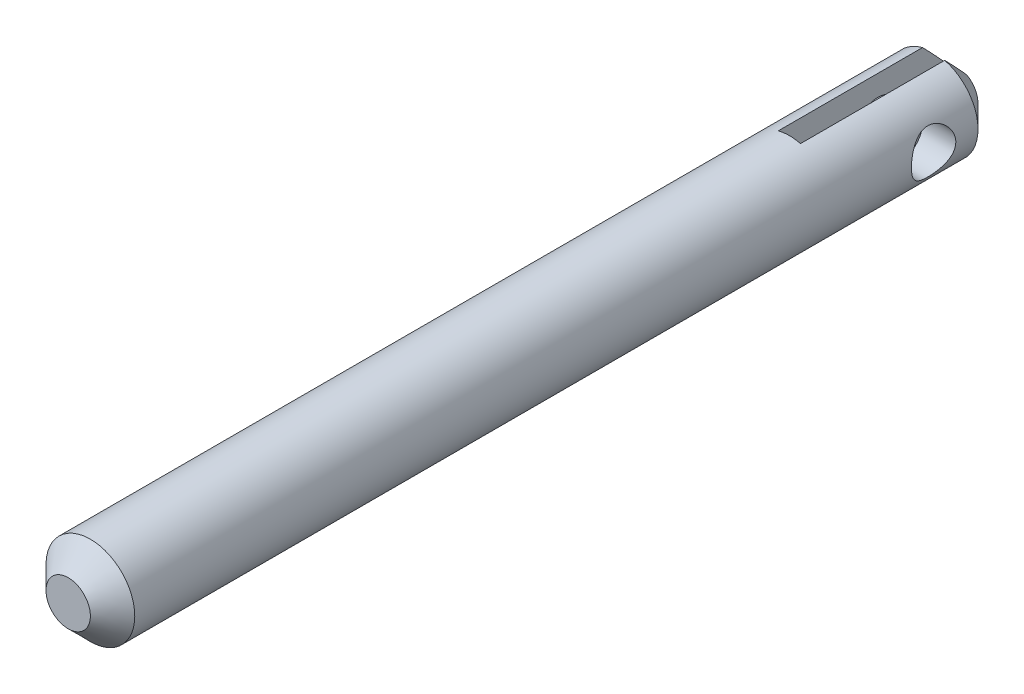
ISO-10303-21;
HEADER;
FILE_DESCRIPTION(('STEP AP214'),'2;1');
FILE_NAME('part.step','',(''),(''),'','','');
FILE_SCHEMA(('AUTOMOTIVE_DESIGN { 1 0 10303 214 1 1 1 1 }'));
ENDSEC;
DATA;
#1=APPLICATION_CONTEXT('core data for automotive mechanical design processes');
#2=APPLICATION_PROTOCOL_DEFINITION('international standard','automotive_design',2000,#1);
#3=PRODUCT_CONTEXT('',#1,'mechanical');
#4=PRODUCT('Part','Part','',(#3));
#5=PRODUCT_RELATED_PRODUCT_CATEGORY('part','',(#4));
#6=PRODUCT_DEFINITION_FORMATION('','',#4);
#7=PRODUCT_DEFINITION_CONTEXT('part definition',#1,'design');
#8=PRODUCT_DEFINITION('design','',#6,#7);
#9=PRODUCT_DEFINITION_SHAPE('','',#8);
#10=(LENGTH_UNIT() NAMED_UNIT(*) SI_UNIT(.MILLI.,.METRE.));
#11=(NAMED_UNIT(*) PLANE_ANGLE_UNIT() SI_UNIT($,.RADIAN.));
#12=(NAMED_UNIT(*) SI_UNIT($,.STERADIAN.) SOLID_ANGLE_UNIT());
#13=UNCERTAINTY_MEASURE_WITH_UNIT(LENGTH_MEASURE(1.E-05),#10,'distance_accuracy_value','');
#14=(GEOMETRIC_REPRESENTATION_CONTEXT(3) GLOBAL_UNCERTAINTY_ASSIGNED_CONTEXT((#13)) GLOBAL_UNIT_ASSIGNED_CONTEXT((#10,
#11,#12)) REPRESENTATION_CONTEXT('',''));
#15=CARTESIAN_POINT('',(0.,0.,0.));
#16=DIRECTION('',(0.,0.,1.));
#17=DIRECTION('',(1.,0.,0.));
#18=AXIS2_PLACEMENT_3D('',#15,#16,#17);
#19=CARTESIAN_POINT('',(0.,0.,0.));
#20=DIRECTION('',(0.,0.,1.));
#21=DIRECTION('',(1.,0.,0.));
#22=AXIS2_PLACEMENT_3D('',#19,#20,#21);
#23=PLANE('',#22);
#24=CARTESIAN_POINT('',(0.,0.,0.));
#25=DIRECTION('',(0.,0.,1.));
#26=DIRECTION('',(1.,0.,0.));
#27=AXIS2_PLACEMENT_3D('',#24,#25,#26);
#28=CIRCLE('',#27,0.999999999999997);
#29=CARTESIAN_POINT('',(-0.5,-0.866025403784436,0.));
#30=VERTEX_POINT('',#29);
#31=CARTESIAN_POINT('',(-0.5,0.866025403784436,0.));
#32=VERTEX_POINT('',#31);
#33=EDGE_CURVE('E109',#30,#32,#28,.F.);
#34=ORIENTED_EDGE('',*,*,#33,.T.);
#35=DIRECTION('',(0.,1.,0.));
#36=VECTOR('',#35,1.);
#37=CARTESIAN_POINT('',(-0.5,-2.,0.));
#38=LINE('',#37,#36);
#39=EDGE_CURVE('E105',#30,#32,#38,.T.);
#40=ORIENTED_EDGE('',*,*,#39,.F.);
#41=EDGE_LOOP('',(#34,#40));
#42=FACE_BOUND('',#41,.T.);
#43=ADVANCED_FACE('F36',(#42),#23,.F.);
#44=CARTESIAN_POINT('',(0.,0.,0.999999999999994));
#45=DIRECTION('',(0.,0.,1.));
#46=DIRECTION('',(1.,0.,0.));
#47=AXIS2_PLACEMENT_3D('',#44,#45,#46);
#48=CONICAL_SURFACE('',#47,2.,0.785398163397453);
#49=CARTESIAN_POINT('',(-0.5,-4.44603678424197,3.47406337537059));
#50=CARTESIAN_POINT('',(-0.5,-4.3227206715832,3.35152236187326));
#51=CARTESIAN_POINT('',(-0.5,-4.19937524468683,3.22901082680239));
#52=CARTESIAN_POINT('',(-0.5,-3.95257998556471,2.98405036082719));
#53=CARTESIAN_POINT('',(-0.5,-3.82913013899456,2.86160144437566));
#54=CARTESIAN_POINT('',(-0.5,-3.58165551808931,2.61634908001688));
#55=CARTESIAN_POINT('',(-0.5,-3.45763033572941,2.4935460436531));
#56=CARTESIAN_POINT('',(-0.5,-3.20945063079193,2.24811314451892));
#57=CARTESIAN_POINT('',(-0.5,-3.08529613387822,2.12548325578782));
#58=CARTESIAN_POINT('',(-0.5,-2.77363505064184,1.81816405947329));
#59=CARTESIAN_POINT('',(-0.5,-2.58599766191415,1.63360712958114));
#60=CARTESIAN_POINT('',(-0.5,-2.30382683253063,1.35738408197601));
#61=CARTESIAN_POINT('',(-0.5,-2.20962124622178,1.26538316744615));
#62=CARTESIAN_POINT('',(-0.5,-2.02089626436621,1.08171683230788));
#63=CARTESIAN_POINT('',(-0.5,-1.92637689171396,0.990051388206098));
#64=CARTESIAN_POINT('',(-0.5,-1.73718945551098,0.807542372110986));
#65=CARTESIAN_POINT('',(-0.5,-1.64252308823347,0.716697042520705));
#66=CARTESIAN_POINT('',(-0.5,-1.45240520475053,0.53577603543908));
#67=CARTESIAN_POINT('',(-0.5,-1.35695348385581,0.44570057193064));
#68=CARTESIAN_POINT('',(-0.5,-1.21282012190368,0.311726773969056));
#69=CARTESIAN_POINT('',(-0.5,-1.16464480862448,0.267284385523587));
#70=CARTESIAN_POINT('',(-0.5,-1.06782166272242,0.1789180888612));
#71=CARTESIAN_POINT('',(-0.5,-1.01917384241703,0.134994167194493));
#72=CARTESIAN_POINT('',(-0.5,-0.921222596912434,0.0479255156373607));
#73=CARTESIAN_POINT('',(-0.5,-0.871919466136489,0.00478045507843078));
#74=CARTESIAN_POINT('',(-0.5,-0.772311305041751,-0.0803338258828356));
#75=CARTESIAN_POINT('',(-0.5,-0.72200645694907,-0.122303256864825));
#76=CARTESIAN_POINT('',(-0.5,-0.65149321054328,-0.17883488716326));
#77=CARTESIAN_POINT('',(-0.5,-0.631969983670817,-0.194250578412427));
#78=CARTESIAN_POINT('',(-0.5,-0.592637810502782,-0.224716769537537));
#79=CARTESIAN_POINT('',(-0.5,-0.572828845167677,-0.239767244897253));
#80=CARTESIAN_POINT('',(-0.5,-0.532816304711589,-0.269443972815506));
#81=CARTESIAN_POINT('',(-0.5,-0.512611858511311,-0.28406905658357));
#82=CARTESIAN_POINT('',(-0.5,-0.471778002673711,-0.312712001773009));
#83=CARTESIAN_POINT('',(-0.5,-0.451148618151649,-0.326729898930044));
#84=CARTESIAN_POINT('',(-0.5,-0.389725284000325,-0.366812255810276));
#85=CARTESIAN_POINT('',(-0.5,-0.348219648254825,-0.391802836694503));
#86=CARTESIAN_POINT('',(-0.5,-0.262471524689434,-0.436470401197677));
#87=CARTESIAN_POINT('',(-0.5,-0.218243708302737,-0.456173246935546));
#88=CARTESIAN_POINT('',(-0.5,-0.157915122745705,-0.475833014533252));
#89=CARTESIAN_POINT('',(-0.5,-0.143227675939815,-0.480086949198978));
#90=CARTESIAN_POINT('',(-0.5,-0.11357147305082,-0.487466537718485));
#91=CARTESIAN_POINT('',(-0.5,-0.0986026862964455,-0.490592067795803));
#92=CARTESIAN_POINT('',(-0.5,-0.053501854282216,-0.49800886081896));
#93=CARTESIAN_POINT('',(-0.5,-0.0230197446515738,-0.500394111330576));
#94=CARTESIAN_POINT('',(-0.5,0.0379114890702295,-0.499495019568158));
#95=CARTESIAN_POINT('',(-0.5,0.0683603905728206,-0.496198108339018));
#96=CARTESIAN_POINT('',(-0.5,0.128387944823114,-0.484630744804087));
#97=CARTESIAN_POINT('',(-0.5,0.157961869058981,-0.476337136280714));
#98=CARTESIAN_POINT('',(-0.5,0.219675531259927,-0.454740251691526));
#99=CARTESIAN_POINT('',(-0.5,0.251624169040896,-0.440912590019053));
#100=CARTESIAN_POINT('',(-0.5,0.314035229494609,-0.410187696818644));
#101=CARTESIAN_POINT('',(-0.5,0.344494453888376,-0.393284198610165));
#102=CARTESIAN_POINT('',(-0.5,0.404423326094302,-0.357364838420675));
#103=CARTESIAN_POINT('',(-0.5,0.433884095942447,-0.338334416828272));
#104=CARTESIAN_POINT('',(-0.5,0.491854249212714,-0.298950838387117));
#105=CARTESIAN_POINT('',(-0.5,0.520364533461652,-0.278598991169034));
#106=CARTESIAN_POINT('',(-0.5,0.57953638557919,-0.234868690858261));
#107=CARTESIAN_POINT('',(-0.5,0.61012487840831,-0.211392016073704));
#108=CARTESIAN_POINT('',(-0.5,0.670685469991521,-0.163654092651001));
#109=CARTESIAN_POINT('',(-0.5,0.700657490605547,-0.139392745543256));
#110=CARTESIAN_POINT('',(-0.5,0.789910467414984,-0.0657542946222947));
#111=CARTESIAN_POINT('',(-0.5,0.848501374616072,-0.0155433842417226));
#112=CARTESIAN_POINT('',(-0.5,0.96468190327177,0.0862035800493809));
#113=CARTESIAN_POINT('',(-0.5,1.02226967341413,0.137741722138128));
#114=CARTESIAN_POINT('',(-0.5,1.13671607175039,0.241590000612502));
#115=CARTESIAN_POINT('',(-0.5,1.19357488865283,0.293899929338012));
#116=CARTESIAN_POINT('',(-0.5,1.30660824877016,0.398852510186987));
#117=CARTESIAN_POINT('',(-0.5,1.36278450331995,0.451493325098276));
#118=CARTESIAN_POINT('',(-0.5,1.47479874614674,0.55714070014306));
#119=CARTESIAN_POINT('',(-0.5,1.53063671159729,0.610147284452255));
#120=CARTESIAN_POINT('',(-0.5,1.69767409668002,0.769453073180862));
#121=CARTESIAN_POINT('',(-0.5,1.80850445415864,0.876138902556319));
#122=CARTESIAN_POINT('',(-0.5,2.02526052218298,1.08589990474619));
#123=CARTESIAN_POINT('',(-0.5,2.13120809224941,1.18895255667403));
#124=CARTESIAN_POINT('',(-0.5,2.34276011157614,1.39541124747761));
#125=CARTESIAN_POINT('',(-0.5,2.44836455773809,1.49881728952719));
#126=CARTESIAN_POINT('',(-0.5,2.76491471755691,1.80946387050409));
#127=CARTESIAN_POINT('',(-0.5,2.9755166563407,2.01705446782083));
#128=CARTESIAN_POINT('',(-0.5,3.3963075770168,2.43276289941646));
#129=CARTESIAN_POINT('',(-0.5,3.60649643659262,2.64088085731374));
#130=CARTESIAN_POINT('',(-0.5,4.0264903553922,3.05733239744869));
#131=CARTESIAN_POINT('',(-0.5,4.23629553628027,3.26566585695367));
#132=CARTESIAN_POINT('',(-0.5,4.44603678424197,3.47406337537059));
#133=B_SPLINE_CURVE_WITH_KNOTS('',3,(#49,#50,#51,#52,#53,#54,#55,#56,#57,#58,#59,#60,#61,#62,
#63,#64,#65,#66,#67,#68,#69,#70,#71,#72,#73,#74,#75,#76,#77,#78,#79,#80,#81,#82,#83,#84,#85,#86,
#87,#88,#89,#90,#91,#92,#93,#94,#95,#96,#97,#98,#99,#100,#101,#102,#103,#104,#105,#106,#107,
#108,#109,#110,#111,#112,#113,#114,#115,#116,#117,#118,#119,#120,#121,#122,#123,#124,#125,#126,
#127,#128,#129,#130,#131,#132),.UNSPECIFIED.,.F.,.F.,(4,2,2,2,2,2,2,2,2,2,2,2,2,2,2,2,2,2,2,2,2,
2,2,2,2,2,2,2,2,2,2,2,2,2,2,2,2,2,2,2,2,4),(0.,0.52154432836011,1.0431786634275,
1.56678666823809,2.0903053798536,2.87987371953262,3.27490459120053,3.66990724771142,
4.06351864674716,4.45723610652558,4.65386510843406,4.85048899823793,5.04702734826837,
5.24353026612086,5.318153993864,5.39278271717141,5.4676001273821,5.54241312825251,
5.68761009114374,5.83208339459153,5.87791587083469,5.92375337298741,6.01494038558717,
6.10632936304399,6.19814515813898,6.30233063734536,6.40673080938628,6.5118953495974,
6.61695720953487,6.73261636183252,6.84829008510541,7.07973925614524,7.31157799287665,
7.54335544829075,7.77431114472918,8.00528225536737,8.4667829423648,8.91018107033853,
9.35358319105067,10.2407247351352,11.1280981426156,12.0151092397737),.UNSPECIFIED.);
#134=CARTESIAN_POINT('',(-0.5,-1.93649167310371,0.999999999999994));
#135=VERTEX_POINT('',#134);
#136=EDGE_CURVE('E188',#135,#30,#133,.T.);
#137=ORIENTED_EDGE('',*,*,#136,.F.);
#138=CARTESIAN_POINT('',(0.,0.,0.999999999999994));
#139=DIRECTION('',(0.,0.,1.));
#140=DIRECTION('',(1.,0.,0.));
#141=AXIS2_PLACEMENT_3D('',#138,#139,#140);
#142=CIRCLE('',#141,2.);
#143=CARTESIAN_POINT('',(-0.5,1.93649167310366,0.999999999999853));
#144=VERTEX_POINT('',#143);
#145=EDGE_CURVE('E110',#144,#135,#142,.T.);
#146=ORIENTED_EDGE('',*,*,#145,.F.);
#147=EDGE_CURVE('E98',#32,#144,#133,.T.);
#148=ORIENTED_EDGE('',*,*,#147,.F.);
#149=ORIENTED_EDGE('',*,*,#33,.F.);
#150=EDGE_LOOP('',(#137,#146,#148,#149));
#151=FACE_BOUND('',#150,.T.);
#152=ADVANCED_FACE('F155',(#151),#48,.T.);
#153=CARTESIAN_POINT('',(0.,0.,40.));
#154=DIRECTION('',(0.,0.,-1.));
#155=DIRECTION('',(-1.,0.,0.));
#156=AXIS2_PLACEMENT_3D('',#153,#154,#155);
#157=CYLINDRICAL_SURFACE('',#156,2.);
#158=CARTESIAN_POINT('',(-2.,0.,2.));
#159=CARTESIAN_POINT('',(-1.99999713404151,0.0525719629529865,2.0000033023195));
#160=CARTESIAN_POINT('',(-1.99790491019518,0.105206599698033,2.00417007312168));
#161=CARTESIAN_POINT('',(-1.98974156037396,0.208920235268425,2.02065288034092));
#162=CARTESIAN_POINT('',(-1.98366287828984,0.259996086713504,2.03298439299765));
#163=CARTESIAN_POINT('',(-1.96816279403312,0.358933544880574,2.06519380861679));
#164=CARTESIAN_POINT('',(-1.9587543917752,0.40680680293918,2.08504238424801));
#165=CARTESIAN_POINT('',(-1.93745776515779,0.498472616806565,2.13157062136494));
#166=CARTESIAN_POINT('',(-1.9255697363353,0.54226549399005,2.15824974424885));
#167=CARTESIAN_POINT('',(-1.89956258258057,0.627507817761919,2.2195172494853));
#168=CARTESIAN_POINT('',(-1.88535199127536,0.668655211122112,2.25448647923964));
#169=CARTESIAN_POINT('',(-1.85659970246744,0.744779444866977,2.33052147924703));
#170=CARTESIAN_POINT('',(-1.84205776209035,0.779751583106767,2.37159185177244));
#171=CARTESIAN_POINT('',(-1.81298951197347,0.845252000450279,2.46248334952338));
#172=CARTESIAN_POINT('',(-1.79855186970132,0.875225335551637,2.51273609834591));
#173=CARTESIAN_POINT('',(-1.77285978772321,0.926168226890696,2.61836733598621));
#174=CARTESIAN_POINT('',(-1.7616030760699,0.947144214966334,2.67374212872275));
#175=CARTESIAN_POINT('',(-1.74457867037809,0.978132442188589,2.78466510542192));
#176=CARTESIAN_POINT('',(-1.73852271583714,0.988725857080441,2.84000445206739));
#177=CARTESIAN_POINT('',(-1.73181889948528,1.00042699330885,2.95197883777948));
#178=CARTESIAN_POINT('',(-1.73116569343288,1.00154408837307,3.00861254087116));
#179=CARTESIAN_POINT('',(-1.73510930257248,0.994687287172295,3.11428602431537));
#180=CARTESIAN_POINT('',(-1.73908763662014,0.987784559536822,3.16342403122305));
#181=CARTESIAN_POINT('',(-1.7507622873385,0.966939849056933,3.25972190937304));
#182=CARTESIAN_POINT('',(-1.75845978831776,0.952995623897652,3.30688114530532));
#183=CARTESIAN_POINT('',(-1.77687476412741,0.918209780386004,3.39922913256566));
#184=CARTESIAN_POINT('',(-1.78765840663999,0.897215067115995,3.44434639878579));
#185=CARTESIAN_POINT('',(-1.81103404281404,0.849041687668003,3.53063429259001));
#186=CARTESIAN_POINT('',(-1.82362684780191,0.821860243812468,3.57180313560009));
#187=CARTESIAN_POINT('',(-1.85113157903286,0.758066054912789,3.65452125274323));
#188=CARTESIAN_POINT('',(-1.86613510236746,0.720694458369282,3.69545687357616));
#189=CARTESIAN_POINT('',(-1.89547623300407,0.639555578741374,3.7707354185909));
#190=CARTESIAN_POINT('',(-1.90981351958801,0.595785256574285,3.80507519203388));
#191=CARTESIAN_POINT('',(-1.93701987282964,0.500516505831848,3.86768566102973));
#192=CARTESIAN_POINT('',(-1.94978984162007,0.448753591599409,3.89560047244574));
#193=CARTESIAN_POINT('',(-1.97157881121242,0.340466215488797,3.94209702904301));
#194=CARTESIAN_POINT('',(-1.98060078943553,0.283945576265277,3.96068618501517));
#195=CARTESIAN_POINT('',(-1.99324333741436,0.172766491660702,3.98647540371668));
#196=CARTESIAN_POINT('',(-1.99724938301312,0.118341530548324,3.99449123574678));
#197=CARTESIAN_POINT('',(-2.00073013459102,0.00877959994935381,4.00146473113449));
#198=CARTESIAN_POINT('',(-2.00020698721312,-0.0463570198699012,4.00042668563948));
#199=CARTESIAN_POINT('',(-1.99491192253441,-0.151232971985993,3.98979331158125));
#200=CARTESIAN_POINT('',(-1.9904724568819,-0.201059408049954,3.98086746726997));
#201=CARTESIAN_POINT('',(-1.97822171314819,-0.298406892301917,3.95576192810492));
#202=CARTESIAN_POINT('',(-1.97041006334332,-0.345927685690997,3.93958143354664));
#203=CARTESIAN_POINT('',(-1.95184251413669,-0.438888608449665,3.90000153356683));
#204=CARTESIAN_POINT('',(-1.94100881769939,-0.484230397006154,3.87640894988319));
#205=CARTESIAN_POINT('',(-1.91743974317109,-0.570461361698921,3.82289246435396));
#206=CARTESIAN_POINT('',(-1.90470355565785,-0.611348629775282,3.79296586540657));
#207=CARTESIAN_POINT('',(-1.87708221337464,-0.691767689290653,3.72423957466713));
#208=CARTESIAN_POINT('',(-1.86210884848441,-0.730772077824639,3.68485713154644));
#209=CARTESIAN_POINT('',(-1.83262391603874,-0.80185632111324,3.6000748487307));
#210=CARTESIAN_POINT('',(-1.81811267381526,-0.833931385690841,3.55467088118363));
#211=CARTESIAN_POINT('',(-1.79051192226068,-0.891707914497696,3.45635634579969));
#212=CARTESIAN_POINT('',(-1.77752529663472,-0.917025495878637,3.40318873379141));
#213=CARTESIAN_POINT('',(-1.75574072368126,-0.958082826013803,3.29248993230748));
#214=CARTESIAN_POINT('',(-1.74693738240618,-0.97383491588757,3.23496447349881));
#215=CARTESIAN_POINT('',(-1.73561501008667,-0.993861687449679,3.12308977713855));
#216=CARTESIAN_POINT('',(-1.73257383460491,-0.999092996400865,3.06896574657096));
#217=CARTESIAN_POINT('',(-1.73165354646175,-1.00068915438079,2.96055293282927));
#218=CARTESIAN_POINT('',(-1.73377219627553,-0.997057846624399,2.90626423126057));
#219=CARTESIAN_POINT('',(-1.74237862050025,-0.981926125592263,2.80451649846799));
#220=CARTESIAN_POINT('',(-1.74843094482394,-0.9712083143428,2.7568995298556));
#221=CARTESIAN_POINT('',(-1.76371016187918,-0.943175358224645,2.66419188057529));
#222=CARTESIAN_POINT('',(-1.77293807569676,-0.92585809115981,2.61910201790803));
#223=CARTESIAN_POINT('',(-1.79428530364528,-0.883815745300683,2.52937514901339));
#224=CARTESIAN_POINT('',(-1.80655722396191,-0.858671137816458,2.4849720981703));
#225=CARTESIAN_POINT('',(-1.8323533163459,-0.802150971636635,2.40072546381941));
#226=CARTESIAN_POINT('',(-1.84587813794522,-0.770772171238649,2.36088426948151));
#227=CARTESIAN_POINT('',(-1.87462323159313,-0.698203326664642,2.28185801764238));
#228=CARTESIAN_POINT('',(-1.88984983311469,-0.656284423010172,2.24334089763808));
#229=CARTESIAN_POINT('',(-1.91877752255088,-0.56615480622028,2.17373701657637));
#230=CARTESIAN_POINT('',(-1.9324777860804,-0.517940723256786,2.14265426057371));
#231=CARTESIAN_POINT('',(-1.95698009585103,-0.415931596819947,2.0887636372378));
#232=CARTESIAN_POINT('',(-1.96776096562909,-0.362099503934615,2.06601583058857));
#233=CARTESIAN_POINT('',(-1.98501341363465,-0.250742101294192,2.03019183208105));
#234=CARTESIAN_POINT('',(-1.99149723372932,-0.193227799623167,2.01708815317042));
#235=CARTESIAN_POINT('',(-1.99695461909663,-0.112601946483384,2.00610258892415));
#236=CARTESIAN_POINT('',(-1.99809365339202,-0.090161879439499,2.00381735913638));
#237=CARTESIAN_POINT('',(-1.99961696977865,-0.0451517318071578,2.00076533448319));
#238=CARTESIAN_POINT('',(-2.00000123103763,-0.0225816476473815,1.9999985815288));
#239=CARTESIAN_POINT('',(-2.,0.,2.));
#240=B_SPLINE_CURVE_WITH_KNOTS('',3,(#158,#159,#160,#161,#162,#163,#164,#165,#166,#167,#168,
#169,#170,#171,#172,#173,#174,#175,#176,#177,#178,#179,#180,#181,#182,#183,#184,#185,#186,#187,
#188,#189,#190,#191,#192,#193,#194,#195,#196,#197,#198,#199,#200,#201,#202,#203,#204,#205,#206,
#207,#208,#209,#210,#211,#212,#213,#214,#215,#216,#217,#218,#219,#220,#221,#222,#223,#224,#225,
#226,#227,#228,#229,#230,#231,#232,#233,#234,#235,#236,#237,#238,#239),.UNSPECIFIED.,.T.,.F.,(4,
2,2,2,2,2,2,2,2,2,2,2,2,2,2,2,2,2,2,2,2,2,2,2,2,2,2,2,2,2,2,2,2,2,2,2,2,2,2,2,4),(0.,
0.157624257420293,0.315548149709198,0.472862155492298,0.630163760581568,0.796981758718089,
0.963926237654036,1.14381726430753,1.32357947898281,1.4925801214023,1.6614135732902,
1.81005712409321,1.95874803925678,2.11090240168487,2.26312521260222,2.43464941333878,
2.60625534598686,2.78583022214441,2.9652621691228,3.12983290471346,3.29432564511476,
3.44606906506122,3.59782921630932,3.75392856027899,3.91009450748339,4.08159610644419,
4.25321588615432,4.43314682159674,4.61284511940778,4.77529307498373,4.93767059860005,
5.08457930244183,5.23153528783678,5.38836456775614,5.54527561138958,5.72125242752498,
5.89732383376573,6.07464013662925,6.2514490862493,6.31915280137698,6.38685838514847),.UNSPECIFIED.);
#241=CARTESIAN_POINT('',(-2.,0.,2.));
#242=VERTEX_POINT('',#241);
#243=EDGE_CURVE('E164',#242,#242,#240,.T.);
#244=ORIENTED_EDGE('',*,*,#243,.T.);
#245=EDGE_LOOP('',(#244));
#246=FACE_BOUND('',#245,.T.);
#247=CARTESIAN_POINT('',(2.,0.,2.));
#248=CARTESIAN_POINT('',(1.99999713404151,-0.0525719629529865,2.0000033023195));
#249=CARTESIAN_POINT('',(1.99790491019518,-0.105206599698033,2.00417007312168));
#250=CARTESIAN_POINT('',(1.98974156037396,-0.208920235268425,2.02065288034092));
#251=CARTESIAN_POINT('',(1.98366287828984,-0.259996086713504,2.03298439299765));
#252=CARTESIAN_POINT('',(1.96816279403312,-0.358933544880574,2.06519380861679));
#253=CARTESIAN_POINT('',(1.9587543917752,-0.40680680293918,2.08504238424801));
#254=CARTESIAN_POINT('',(1.93745776515779,-0.498472616806565,2.13157062136494));
#255=CARTESIAN_POINT('',(1.9255697363353,-0.54226549399005,2.15824974424885));
#256=CARTESIAN_POINT('',(1.89956258258057,-0.627507817761919,2.2195172494853));
#257=CARTESIAN_POINT('',(1.88535199127536,-0.668655211122112,2.25448647923964));
#258=CARTESIAN_POINT('',(1.85659970246744,-0.744779444866977,2.33052147924703));
#259=CARTESIAN_POINT('',(1.84205776209035,-0.779751583106767,2.37159185177244));
#260=CARTESIAN_POINT('',(1.81298951197347,-0.845252000450279,2.46248334952338));
#261=CARTESIAN_POINT('',(1.79855186970132,-0.875225335551637,2.51273609834591));
#262=CARTESIAN_POINT('',(1.77285978772321,-0.926168226890696,2.61836733598621));
#263=CARTESIAN_POINT('',(1.7616030760699,-0.947144214966334,2.67374212872275));
#264=CARTESIAN_POINT('',(1.74457867037809,-0.978132442188589,2.78466510542192));
#265=CARTESIAN_POINT('',(1.73852271583714,-0.988725857080441,2.84000445206739));
#266=CARTESIAN_POINT('',(1.73181889948528,-1.00042699330885,2.95197883777948));
#267=CARTESIAN_POINT('',(1.73116569343288,-1.00154408837307,3.00861254087116));
#268=CARTESIAN_POINT('',(1.73510930257248,-0.994687287172295,3.11428602431537));
#269=CARTESIAN_POINT('',(1.73908763662014,-0.987784559536822,3.16342403122305));
#270=CARTESIAN_POINT('',(1.7507622873385,-0.966939849056933,3.25972190937304));
#271=CARTESIAN_POINT('',(1.75845978831776,-0.952995623897652,3.30688114530532));
#272=CARTESIAN_POINT('',(1.77687476412741,-0.918209780386004,3.39922913256566));
#273=CARTESIAN_POINT('',(1.78765840663999,-0.897215067115995,3.44434639878579));
#274=CARTESIAN_POINT('',(1.81103404281404,-0.849041687668003,3.53063429259001));
#275=CARTESIAN_POINT('',(1.82362684780191,-0.821860243812468,3.57180313560009));
#276=CARTESIAN_POINT('',(1.85113157903286,-0.758066054912789,3.65452125274323));
#277=CARTESIAN_POINT('',(1.86613510236746,-0.720694458369282,3.69545687357616));
#278=CARTESIAN_POINT('',(1.89547623300407,-0.639555578741374,3.7707354185909));
#279=CARTESIAN_POINT('',(1.90981351958801,-0.595785256574285,3.80507519203388));
#280=CARTESIAN_POINT('',(1.93701987282964,-0.500516505831848,3.86768566102973));
#281=CARTESIAN_POINT('',(1.94978984162007,-0.448753591599409,3.89560047244574));
#282=CARTESIAN_POINT('',(1.97157881121242,-0.340466215488797,3.94209702904301));
#283=CARTESIAN_POINT('',(1.98060078943553,-0.283945576265277,3.96068618501517));
#284=CARTESIAN_POINT('',(1.99324333741436,-0.172766491660702,3.98647540371668));
#285=CARTESIAN_POINT('',(1.99724938301312,-0.118341530548324,3.99449123574678));
#286=CARTESIAN_POINT('',(2.00073013459102,-0.00877959994935381,4.00146473113449));
#287=CARTESIAN_POINT('',(2.00020698721312,0.0463570198699012,4.00042668563948));
#288=CARTESIAN_POINT('',(1.99491192253441,0.151232971985993,3.98979331158125));
#289=CARTESIAN_POINT('',(1.9904724568819,0.201059408049954,3.98086746726997));
#290=CARTESIAN_POINT('',(1.97822171314819,0.298406892301917,3.95576192810492));
#291=CARTESIAN_POINT('',(1.97041006334332,0.345927685690997,3.93958143354664));
#292=CARTESIAN_POINT('',(1.95184251413669,0.438888608449665,3.90000153356683));
#293=CARTESIAN_POINT('',(1.94100881769939,0.484230397006154,3.87640894988319));
#294=CARTESIAN_POINT('',(1.91743974317109,0.570461361698921,3.82289246435396));
#295=CARTESIAN_POINT('',(1.90470355565785,0.611348629775282,3.79296586540657));
#296=CARTESIAN_POINT('',(1.87708221337464,0.691767689290653,3.72423957466713));
#297=CARTESIAN_POINT('',(1.86210884848441,0.730772077824639,3.68485713154644));
#298=CARTESIAN_POINT('',(1.83262391603874,0.80185632111324,3.6000748487307));
#299=CARTESIAN_POINT('',(1.81811267381526,0.833931385690841,3.55467088118363));
#300=CARTESIAN_POINT('',(1.79051192226068,0.891707914497696,3.45635634579969));
#301=CARTESIAN_POINT('',(1.77752529663472,0.917025495878637,3.40318873379141));
#302=CARTESIAN_POINT('',(1.75574072368126,0.958082826013803,3.29248993230748));
#303=CARTESIAN_POINT('',(1.74693738240618,0.97383491588757,3.23496447349881));
#304=CARTESIAN_POINT('',(1.73561501008667,0.993861687449679,3.12308977713855));
#305=CARTESIAN_POINT('',(1.73257383460491,0.999092996400865,3.06896574657096));
#306=CARTESIAN_POINT('',(1.73165354646175,1.00068915438079,2.96055293282927));
#307=CARTESIAN_POINT('',(1.73377219627553,0.997057846624399,2.90626423126057));
#308=CARTESIAN_POINT('',(1.74237862050025,0.981926125592263,2.80451649846799));
#309=CARTESIAN_POINT('',(1.74843094482394,0.9712083143428,2.7568995298556));
#310=CARTESIAN_POINT('',(1.76371016187918,0.943175358224645,2.66419188057529));
#311=CARTESIAN_POINT('',(1.77293807569676,0.92585809115981,2.61910201790803));
#312=CARTESIAN_POINT('',(1.79428530364528,0.883815745300683,2.52937514901339));
#313=CARTESIAN_POINT('',(1.80655722396191,0.858671137816458,2.4849720981703));
#314=CARTESIAN_POINT('',(1.8323533163459,0.802150971636635,2.40072546381941));
#315=CARTESIAN_POINT('',(1.84587813794522,0.770772171238649,2.36088426948151));
#316=CARTESIAN_POINT('',(1.87462323159313,0.698203326664642,2.28185801764238));
#317=CARTESIAN_POINT('',(1.88984983311469,0.656284423010172,2.24334089763808));
#318=CARTESIAN_POINT('',(1.91877752255088,0.56615480622028,2.17373701657637));
#319=CARTESIAN_POINT('',(1.9324777860804,0.517940723256786,2.14265426057371));
#320=CARTESIAN_POINT('',(1.95698009585103,0.415931596819947,2.0887636372378));
#321=CARTESIAN_POINT('',(1.96776096562909,0.362099503934615,2.06601583058857));
#322=CARTESIAN_POINT('',(1.98501341363465,0.250742101294192,2.03019183208105));
#323=CARTESIAN_POINT('',(1.99149723372932,0.193227799623167,2.01708815317042));
#324=CARTESIAN_POINT('',(1.99695461909663,0.112601946483384,2.00610258892415));
#325=CARTESIAN_POINT('',(1.99809365339202,0.090161879439499,2.00381735913638));
#326=CARTESIAN_POINT('',(1.99961696977865,0.0451517318071578,2.00076533448319));
#327=CARTESIAN_POINT('',(2.00000123103763,0.0225816476473815,1.9999985815288));
#328=CARTESIAN_POINT('',(2.,0.,2.));
#329=B_SPLINE_CURVE_WITH_KNOTS('',3,(#247,#248,#249,#250,#251,#252,#253,#254,#255,#256,#257,
#258,#259,#260,#261,#262,#263,#264,#265,#266,#267,#268,#269,#270,#271,#272,#273,#274,#275,#276,
#277,#278,#279,#280,#281,#282,#283,#284,#285,#286,#287,#288,#289,#290,#291,#292,#293,#294,#295,
#296,#297,#298,#299,#300,#301,#302,#303,#304,#305,#306,#307,#308,#309,#310,#311,#312,#313,#314,
#315,#316,#317,#318,#319,#320,#321,#322,#323,#324,#325,#326,#327,#328),.UNSPECIFIED.,.T.,.F.,(4,
2,2,2,2,2,2,2,2,2,2,2,2,2,2,2,2,2,2,2,2,2,2,2,2,2,2,2,2,2,2,2,2,2,2,2,2,2,2,2,4),(0.,
0.157624257420293,0.315548149709198,0.472862155492298,0.630163760581568,0.796981758718089,
0.963926237654036,1.14381726430753,1.32357947898281,1.4925801214023,1.6614135732902,
1.81005712409321,1.95874803925678,2.11090240168487,2.26312521260222,2.43464941333878,
2.60625534598686,2.78583022214441,2.9652621691228,3.12983290471346,3.29432564511476,
3.44606906506122,3.59782921630932,3.75392856027899,3.91009450748339,4.08159610644419,
4.25321588615432,4.43314682159674,4.61284511940778,4.77529307498373,4.93767059860005,
5.08457930244183,5.23153528783678,5.38836456775614,5.54527561138958,5.72125242752498,
5.89732383376573,6.07464013662925,6.2514490862493,6.31915280137698,6.38685838514847),.UNSPECIFIED.);
#330=CARTESIAN_POINT('',(2.,0.,2.));
#331=VERTEX_POINT('',#330);
#332=EDGE_CURVE('E159',#331,#331,#329,.T.);
#333=ORIENTED_EDGE('',*,*,#332,.T.);
#334=EDGE_LOOP('',(#333));
#335=FACE_BOUND('',#334,.T.);
#336=CARTESIAN_POINT('',(0.5,-1.93649167310366,0.999999999999853));
#337=VERTEX_POINT('',#336);
#338=CARTESIAN_POINT('',(0.5,1.93649167310371,0.999999999999994));
#339=VERTEX_POINT('',#338);
#340=EDGE_CURVE('E115',#337,#339,#142,.T.);
#341=ORIENTED_EDGE('',*,*,#340,.T.);
#342=DIRECTION('',(0.,0.,-1.));
#343=VECTOR('',#342,1.);
#344=CARTESIAN_POINT('',(0.499999999999996,1.93649167310371,40.));
#345=LINE('',#344,#343);
#346=CARTESIAN_POINT('',(0.499999999999999,1.93649167310371,7.5));
#347=VERTEX_POINT('',#346);
#348=EDGE_CURVE('E93',#339,#347,#345,.F.);
#349=ORIENTED_EDGE('',*,*,#348,.T.);
#350=CARTESIAN_POINT('',(0.,0.,7.5));
#351=DIRECTION('',(0.,0.,1.));
#352=DIRECTION('',(1.,0.,0.));
#353=AXIS2_PLACEMENT_3D('',#350,#351,#352);
#354=CIRCLE('',#353,2.);
#355=CARTESIAN_POINT('',(-0.499999999999999,1.93649167310371,7.5));
#356=VERTEX_POINT('',#355);
#357=EDGE_CURVE('E45',#347,#356,#354,.T.);
#358=ORIENTED_EDGE('',*,*,#357,.T.);
#359=DIRECTION('',(0.,0.,-1.));
#360=VECTOR('',#359,1.);
#361=CARTESIAN_POINT('',(-0.499999999999996,1.93649167310371,40.));
#362=LINE('',#361,#360);
#363=EDGE_CURVE('E178',#356,#144,#362,.T.);
#364=ORIENTED_EDGE('',*,*,#363,.T.);
#365=ORIENTED_EDGE('',*,*,#145,.T.);
#366=DIRECTION('',(0.,0.,-1.));
#367=VECTOR('',#366,1.);
#368=CARTESIAN_POINT('',(-0.499999999999996,-1.93649167310371,40.));
#369=LINE('',#368,#367);
#370=CARTESIAN_POINT('',(-0.499999999999999,-1.93649167310371,7.5));
#371=VERTEX_POINT('',#370);
#372=EDGE_CURVE('E60',#135,#371,#369,.F.);
#373=ORIENTED_EDGE('',*,*,#372,.T.);
#374=CARTESIAN_POINT('',(0.499999999999999,-1.93649167310371,7.5));
#375=VERTEX_POINT('',#374);
#376=EDGE_CURVE('E12',#371,#375,#354,.T.);
#377=ORIENTED_EDGE('',*,*,#376,.T.);
#378=DIRECTION('',(0.,0.,-1.));
#379=VECTOR('',#378,1.);
#380=CARTESIAN_POINT('',(0.499999999999996,-1.93649167310371,40.));
#381=LINE('',#380,#379);
#382=EDGE_CURVE('E170',#375,#337,#381,.T.);
#383=ORIENTED_EDGE('',*,*,#382,.T.);
#384=EDGE_LOOP('',(#341,#349,#358,#364,#365,#373,#377,#383));
#385=FACE_BOUND('',#384,.T.);
#386=CARTESIAN_POINT('',(0.,0.,39.));
#387=DIRECTION('',(0.,0.,1.));
#388=DIRECTION('',(1.,0.,0.));
#389=AXIS2_PLACEMENT_3D('',#386,#387,#388);
#390=CIRCLE('',#389,2.);
#391=CARTESIAN_POINT('',(2.,0.,39.));
#392=VERTEX_POINT('',#391);
#393=EDGE_CURVE('E181',#392,#392,#390,.F.);
#394=ORIENTED_EDGE('',*,*,#393,.T.);
#395=EDGE_LOOP('',(#394));
#396=FACE_BOUND('',#395,.T.);
#397=ADVANCED_FACE('F150',(#246,#335,#385,#396),#157,.T.);
#398=CARTESIAN_POINT('',(0.,0.,40.));
#399=DIRECTION('',(0.,0.,1.));
#400=DIRECTION('',(1.,0.,0.));
#401=AXIS2_PLACEMENT_3D('',#398,#399,#400);
#402=PLANE('',#401);
#403=CARTESIAN_POINT('',(0.,0.,40.));
#404=DIRECTION('',(0.,0.,1.));
#405=DIRECTION('',(1.,0.,0.));
#406=AXIS2_PLACEMENT_3D('',#403,#404,#405);
#407=CIRCLE('',#406,1.);
#408=CARTESIAN_POINT('',(1.,0.,40.));
#409=VERTEX_POINT('',#408);
#410=EDGE_CURVE('E113',#409,#409,#407,.T.);
#411=ORIENTED_EDGE('',*,*,#410,.T.);
#412=EDGE_LOOP('',(#411));
#413=FACE_BOUND('',#412,.T.);
#414=ADVANCED_FACE('F147',(#413),#402,.T.);
#415=CARTESIAN_POINT('',(0.5,0.866025403784435,0.));
#416=VERTEX_POINT('',#415);
#417=CARTESIAN_POINT('',(0.5,-0.866025403784436,0.));
#418=VERTEX_POINT('',#417);
#419=EDGE_CURVE('E104',#416,#418,#28,.F.);
#420=ORIENTED_EDGE('',*,*,#419,.T.);
#421=DIRECTION('',(0.,1.,0.));
#422=VECTOR('',#421,1.);
#423=CARTESIAN_POINT('',(0.5,-2.,0.));
#424=LINE('',#423,#422);
#425=EDGE_CURVE('E52',#418,#416,#424,.T.);
#426=ORIENTED_EDGE('',*,*,#425,.T.);
#427=EDGE_LOOP('',(#420,#426));
#428=FACE_BOUND('',#427,.T.);
#429=ADVANCED_FACE('F103',(#428),#23,.F.);
#430=CARTESIAN_POINT('',(0.5,4.44603678424198,3.47406337537059));
#431=CARTESIAN_POINT('',(0.5,4.32272067158321,3.35152236187326));
#432=CARTESIAN_POINT('',(0.5,4.19937524468683,3.2290108268024));
#433=CARTESIAN_POINT('',(0.5,3.95257998556471,2.9840503608272));
#434=CARTESIAN_POINT('',(0.5,3.82913013899457,2.86160144437567));
#435=CARTESIAN_POINT('',(0.5,3.58165551808932,2.61634908001689));
#436=CARTESIAN_POINT('',(0.5,3.45763033572941,2.49354604365311));
#437=CARTESIAN_POINT('',(0.5,3.20945063079194,2.24811314451893));
#438=CARTESIAN_POINT('',(0.5,3.08529613387823,2.12548325578782));
#439=CARTESIAN_POINT('',(0.5,2.77363505064184,1.81816405947329));
#440=CARTESIAN_POINT('',(0.5,2.58599766191415,1.63360712958115));
#441=CARTESIAN_POINT('',(0.5,2.30382683253063,1.35738408197601));
#442=CARTESIAN_POINT('',(0.5,2.20962124622179,1.26538316744615));
#443=CARTESIAN_POINT('',(0.5,2.02089626436621,1.08171683230788));
#444=CARTESIAN_POINT('',(0.5,1.92637689171397,0.9900513882061));
#445=CARTESIAN_POINT('',(0.5,1.73718945551098,0.807542372110988));
#446=CARTESIAN_POINT('',(0.5,1.64252308823347,0.716697042520707));
#447=CARTESIAN_POINT('',(0.5,1.45240520475054,0.535776035439082));
#448=CARTESIAN_POINT('',(0.5,1.35695348385581,0.445700571930641));
#449=CARTESIAN_POINT('',(0.5,1.21282012190368,0.311726773969057));
#450=CARTESIAN_POINT('',(0.5,1.16464480862448,0.267284385523589));
#451=CARTESIAN_POINT('',(0.5,1.06782166272242,0.178918088861202));
#452=CARTESIAN_POINT('',(0.5,1.01917384241703,0.134994167194495));
#453=CARTESIAN_POINT('',(0.5,0.921222596912436,0.0479255156373619));
#454=CARTESIAN_POINT('',(0.5,0.87191946613649,0.00478045507843181));
#455=CARTESIAN_POINT('',(0.5,0.772311305041752,-0.0803338258828346));
#456=CARTESIAN_POINT('',(0.5,0.722006456949071,-0.122303256864824));
#457=CARTESIAN_POINT('',(0.5,0.651493210543281,-0.178834887163259));
#458=CARTESIAN_POINT('',(0.5,0.631969983670818,-0.194250578412426));
#459=CARTESIAN_POINT('',(0.5,0.592637810502783,-0.224716769537536));
#460=CARTESIAN_POINT('',(0.5,0.572828845167679,-0.239767244897252));
#461=CARTESIAN_POINT('',(0.5,0.53281630471159,-0.269443972815505));
#462=CARTESIAN_POINT('',(0.5,0.512611858511312,-0.284069056583569));
#463=CARTESIAN_POINT('',(0.5,0.471778002673711,-0.312712001773009));
#464=CARTESIAN_POINT('',(0.5,0.45114861815165,-0.326729898930043));
#465=CARTESIAN_POINT('',(0.5,0.389725284000325,-0.366812255810276));
#466=CARTESIAN_POINT('',(0.5,0.348219648254825,-0.391802836694504));
#467=CARTESIAN_POINT('',(0.5,0.262471524689434,-0.436470401197677));
#468=CARTESIAN_POINT('',(0.5,0.218243708302737,-0.456173246935545));
#469=CARTESIAN_POINT('',(0.5,0.157915122745706,-0.475833014533252));
#470=CARTESIAN_POINT('',(0.5,0.143227675939816,-0.480086949198978));
#471=CARTESIAN_POINT('',(0.5,0.113571473050822,-0.487466537718485));
#472=CARTESIAN_POINT('',(0.5,0.0986026862964464,-0.490592067795803));
#473=CARTESIAN_POINT('',(0.5,0.0535018542822165,-0.49800886081896));
#474=CARTESIAN_POINT('',(0.5,0.0230197446515743,-0.500394111330576));
#475=CARTESIAN_POINT('',(0.5,-0.0379114890702291,-0.499495019568158));
#476=CARTESIAN_POINT('',(0.5,-0.0683603905728202,-0.496198108339018));
#477=CARTESIAN_POINT('',(0.5,-0.128387944823114,-0.484630744804087));
#478=CARTESIAN_POINT('',(0.5,-0.157961869058981,-0.476337136280714));
#479=CARTESIAN_POINT('',(0.5,-0.219675531259926,-0.454740251691527));
#480=CARTESIAN_POINT('',(0.5,-0.251624169040895,-0.440912590019053));
#481=CARTESIAN_POINT('',(0.5,-0.314035229494608,-0.410187696818644));
#482=CARTESIAN_POINT('',(0.5,-0.344494453888376,-0.393284198610165));
#483=CARTESIAN_POINT('',(0.5,-0.404423326094301,-0.357364838420675));
#484=CARTESIAN_POINT('',(0.5,-0.433884095942447,-0.338334416828272));
#485=CARTESIAN_POINT('',(0.5,-0.491854249212713,-0.298950838387117));
#486=CARTESIAN_POINT('',(0.5,-0.520364533461652,-0.278598991169035));
#487=CARTESIAN_POINT('',(0.5,-0.579536385579189,-0.234868690858262));
#488=CARTESIAN_POINT('',(0.5,-0.610124878408309,-0.211392016073705));
#489=CARTESIAN_POINT('',(0.5,-0.670685469991519,-0.163654092651003));
#490=CARTESIAN_POINT('',(0.5,-0.700657490605546,-0.139392745543257));
#491=CARTESIAN_POINT('',(0.5,-0.789910467414983,-0.065754294622296));
#492=CARTESIAN_POINT('',(0.5,-0.84850137461607,-0.0155433842417242));
#493=CARTESIAN_POINT('',(0.5,-0.964681903271767,0.0862035800493791));
#494=CARTESIAN_POINT('',(0.5,-1.02226967341413,0.137741722138126));
#495=CARTESIAN_POINT('',(0.5,-1.13671607175038,0.241590000612499));
#496=CARTESIAN_POINT('',(0.5,-1.19357488865283,0.293899929338009));
#497=CARTESIAN_POINT('',(0.5,-1.30660824877015,0.398852510186984));
#498=CARTESIAN_POINT('',(0.5,-1.36278450331995,0.451493325098272));
#499=CARTESIAN_POINT('',(0.5,-1.47479874614673,0.557140700143056));
#500=CARTESIAN_POINT('',(0.5,-1.53063671159728,0.610147284452251));
#501=CARTESIAN_POINT('',(0.5,-1.69767409668002,0.769453073180858));
#502=CARTESIAN_POINT('',(0.5,-1.80850445415864,0.876138902556314));
#503=CARTESIAN_POINT('',(0.5,-2.02526052218298,1.08589990474619));
#504=CARTESIAN_POINT('',(0.5,-2.1312080922494,1.18895255667403));
#505=CARTESIAN_POINT('',(0.5,-2.34276011157614,1.39541124747761));
#506=CARTESIAN_POINT('',(0.5,-2.44836455773809,1.49881728952719));
#507=CARTESIAN_POINT('',(0.5,-2.76491471755691,1.80946387050409));
#508=CARTESIAN_POINT('',(0.5,-2.9755166563407,2.01705446782083));
#509=CARTESIAN_POINT('',(0.5,-3.3963075770168,2.43276289941646));
#510=CARTESIAN_POINT('',(0.5,-3.60649643659262,2.64088085731374));
#511=CARTESIAN_POINT('',(0.5,-4.0264903553922,3.05733239744869));
#512=CARTESIAN_POINT('',(0.5,-4.23629553628028,3.26566585695367));
#513=CARTESIAN_POINT('',(0.5,-4.44603678424198,3.47406337537059));
#514=B_SPLINE_CURVE_WITH_KNOTS('',3,(#430,#431,#432,#433,#434,#435,#436,#437,#438,#439,#440,
#441,#442,#443,#444,#445,#446,#447,#448,#449,#450,#451,#452,#453,#454,#455,#456,#457,#458,#459,
#460,#461,#462,#463,#464,#465,#466,#467,#468,#469,#470,#471,#472,#473,#474,#475,#476,#477,#478,
#479,#480,#481,#482,#483,#484,#485,#486,#487,#488,#489,#490,#491,#492,#493,#494,#495,#496,#497,
#498,#499,#500,#501,#502,#503,#504,#505,#506,#507,#508,#509,#510,#511,#512,#513),.UNSPECIFIED.,
.F.,.F.,(4,2,2,2,2,2,2,2,2,2,2,2,2,2,2,2,2,2,2,2,2,2,2,2,2,2,2,2,2,2,2,2,2,2,2,2,2,2,2,2,2,4),
(0.,0.521544328360111,1.0431786634275,1.56678666823809,2.09030537985361,2.87987371953262,
3.27490459120054,3.66990724771143,4.06351864674716,4.45723610652559,4.65386510843406,
4.85048899823793,5.04702734826837,5.24353026612087,5.31815399386401,5.39278271717142,
5.46760012738211,5.54241312825252,5.68761009114375,5.83208339459154,5.87791587083469,
5.92375337298742,6.01494038558718,6.106329363044,6.19814515813898,6.30233063734536,
6.40673080938629,6.51189534959741,6.61695720953487,6.73261636183252,6.84829008510541,
7.07973925614525,7.31157799287665,7.54335544829075,7.77431114472918,8.00528225536737,
8.4667829423648,8.91018107033853,9.35358319105068,10.2407247351353,11.1280981426156,
12.0151092397737),.UNSPECIFIED.);
#515=EDGE_CURVE('E89',#339,#416,#514,.T.);
#516=ORIENTED_EDGE('',*,*,#515,.F.);
#517=ORIENTED_EDGE('',*,*,#340,.F.);
#518=EDGE_CURVE('E99',#418,#337,#514,.T.);
#519=ORIENTED_EDGE('',*,*,#518,.F.);
#520=ORIENTED_EDGE('',*,*,#419,.F.);
#521=EDGE_LOOP('',(#516,#517,#519,#520));
#522=FACE_BOUND('',#521,.T.);
#523=ADVANCED_FACE('F108',(#522),#48,.T.);
#524=CARTESIAN_POINT('',(0.,0.,40.));
#525=DIRECTION('',(0.,0.,-1.));
#526=DIRECTION('',(-1.,0.,0.));
#527=AXIS2_PLACEMENT_3D('',#524,#525,#526);
#528=CONICAL_SURFACE('',#527,1.,0.785398163397442);
#529=ORIENTED_EDGE('',*,*,#393,.F.);
#530=EDGE_LOOP('',(#529));
#531=FACE_BOUND('',#530,.T.);
#532=ORIENTED_EDGE('',*,*,#410,.F.);
#533=EDGE_LOOP('',(#532));
#534=FACE_BOUND('',#533,.T.);
#535=ADVANCED_FACE('F38',(#531,#534),#528,.T.);
#536=CARTESIAN_POINT('',(-0.499999999999999,-2.,7.5));
#537=DIRECTION('',(0.,0.,1.));
#538=DIRECTION('',(1.,0.,0.));
#539=AXIS2_PLACEMENT_3D('',#536,#537,#538);
#540=PLANE('',#539);
#541=DIRECTION('',(0.,1.,0.));
#542=VECTOR('',#541,1.);
#543=CARTESIAN_POINT('',(0.499999999999999,-2.,7.5));
#544=LINE('',#543,#542);
#545=EDGE_CURVE('E106',#375,#347,#544,.T.);
#546=ORIENTED_EDGE('',*,*,#545,.F.);
#547=ORIENTED_EDGE('',*,*,#376,.F.);
#548=DIRECTION('',(0.,1.,0.));
#549=VECTOR('',#548,1.);
#550=CARTESIAN_POINT('',(-0.499999999999999,-2.,7.5));
#551=LINE('',#550,#549);
#552=EDGE_CURVE('E169',#371,#356,#551,.T.);
#553=ORIENTED_EDGE('',*,*,#552,.T.);
#554=ORIENTED_EDGE('',*,*,#357,.F.);
#555=EDGE_LOOP('',(#546,#547,#553,#554));
#556=FACE_BOUND('',#555,.T.);
#557=ADVANCED_FACE('F140',(#556),#540,.F.);
#558=CARTESIAN_POINT('',(-0.5,-2.,0.));
#559=DIRECTION('',(-1.,0.,0.));
#560=DIRECTION('',(0.,0.,1.));
#561=AXIS2_PLACEMENT_3D('',#558,#559,#560);
#562=PLANE('',#561);
#563=CARTESIAN_POINT('',(-0.5,0.,3.));
#564=DIRECTION('',(-1.,0.,0.));
#565=DIRECTION('',(0.,0.,1.));
#566=AXIS2_PLACEMENT_3D('',#563,#564,#565);
#567=CIRCLE('',#566,1.);
#568=CARTESIAN_POINT('',(-0.5,0.,4.));
#569=VERTEX_POINT('',#568);
#570=EDGE_CURVE('E281',#569,#569,#567,.T.);
#571=ORIENTED_EDGE('',*,*,#570,.T.);
#572=EDGE_LOOP('',(#571));
#573=FACE_BOUND('',#572,.T.);
#574=ORIENTED_EDGE('',*,*,#136,.T.);
#575=ORIENTED_EDGE('',*,*,#39,.T.);
#576=ORIENTED_EDGE('',*,*,#147,.T.);
#577=ORIENTED_EDGE('',*,*,#363,.F.);
#578=ORIENTED_EDGE('',*,*,#552,.F.);
#579=ORIENTED_EDGE('',*,*,#372,.F.);
#580=EDGE_LOOP('',(#574,#575,#576,#577,#578,#579));
#581=FACE_BOUND('',#580,.T.);
#582=ADVANCED_FACE('F136',(#573,#581),#562,.F.);
#583=CARTESIAN_POINT('',(0.5,-2.,0.));
#584=DIRECTION('',(1.,0.,0.));
#585=DIRECTION('',(0.,0.,-1.));
#586=AXIS2_PLACEMENT_3D('',#583,#584,#585);
#587=PLANE('',#586);
#588=CARTESIAN_POINT('',(0.5,0.,3.));
#589=DIRECTION('',(1.,0.,0.));
#590=DIRECTION('',(0.,0.,-1.));
#591=AXIS2_PLACEMENT_3D('',#588,#589,#590);
#592=CIRCLE('',#591,1.);
#593=CARTESIAN_POINT('',(0.5,0.,2.));
#594=VERTEX_POINT('',#593);
#595=EDGE_CURVE('E40',#594,#594,#592,.T.);
#596=ORIENTED_EDGE('',*,*,#595,.T.);
#597=EDGE_LOOP('',(#596));
#598=FACE_BOUND('',#597,.T.);
#599=ORIENTED_EDGE('',*,*,#515,.T.);
#600=ORIENTED_EDGE('',*,*,#425,.F.);
#601=ORIENTED_EDGE('',*,*,#518,.T.);
#602=ORIENTED_EDGE('',*,*,#382,.F.);
#603=ORIENTED_EDGE('',*,*,#545,.T.);
#604=ORIENTED_EDGE('',*,*,#348,.F.);
#605=EDGE_LOOP('',(#599,#600,#601,#602,#603,#604));
#606=FACE_BOUND('',#605,.T.);
#607=ADVANCED_FACE('F90',(#598,#606),#587,.F.);
#608=CARTESIAN_POINT('',(-2.,0.,3.));
#609=DIRECTION('',(1.,0.,0.));
#610=DIRECTION('',(0.,0.,-1.));
#611=AXIS2_PLACEMENT_3D('',#608,#609,#610);
#612=CYLINDRICAL_SURFACE('',#611,1.);
#613=ORIENTED_EDGE('',*,*,#595,.F.);
#614=EDGE_LOOP('',(#613));
#615=FACE_BOUND('',#614,.T.);
#616=ORIENTED_EDGE('',*,*,#332,.F.);
#617=EDGE_LOOP('',(#616));
#618=FACE_BOUND('',#617,.T.);
#619=ADVANCED_FACE('F135',(#615,#618),#612,.F.);
#620=ORIENTED_EDGE('',*,*,#570,.F.);
#621=EDGE_LOOP('',(#620));
#622=FACE_BOUND('',#621,.T.);
#623=ORIENTED_EDGE('',*,*,#243,.F.);
#624=EDGE_LOOP('',(#623));
#625=FACE_BOUND('',#624,.T.);
#626=ADVANCED_FACE('F138',(#622,#625),#612,.F.);
#627=CLOSED_SHELL('',(#43,#152,#397,#414,#429,#523,#535,#557,#582,#607,#619,#626));
#628=MANIFOLD_SOLID_BREP('B2',#627);
#629=ADVANCED_BREP_SHAPE_REPRESENTATION('',(#18,#628),#14);
#630=SHAPE_DEFINITION_REPRESENTATION(#9,#629);
ENDSEC;
END-ISO-10303-21;
